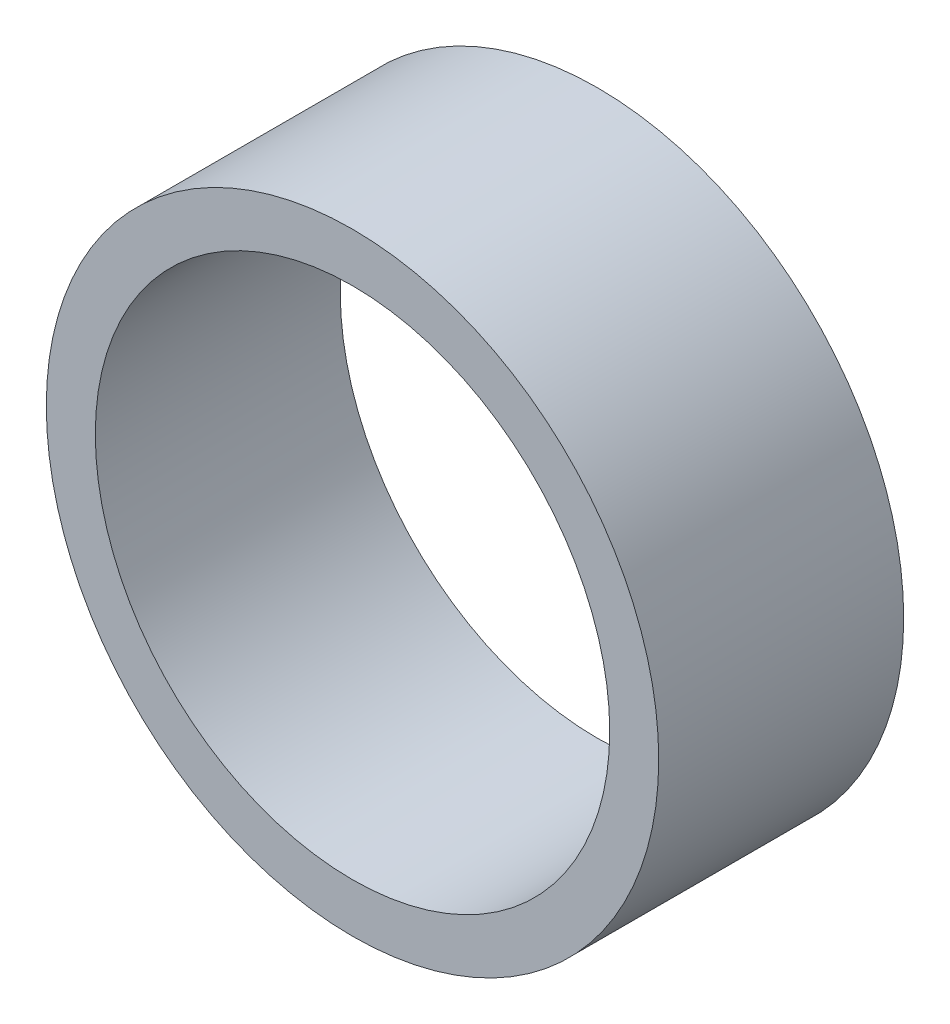
ISO-10303-21;
HEADER;
FILE_DESCRIPTION(('STEP AP214'),'2;1');
FILE_NAME('part.step','',(''),(''),'','','');
FILE_SCHEMA(('AUTOMOTIVE_DESIGN { 1 0 10303 214 1 1 1 1 }'));
ENDSEC;
DATA;
#1=APPLICATION_CONTEXT('core data for automotive mechanical design processes');
#2=APPLICATION_PROTOCOL_DEFINITION('international standard','automotive_design',2000,#1);
#3=PRODUCT_CONTEXT('',#1,'mechanical');
#4=PRODUCT('Part','Part','',(#3));
#5=PRODUCT_RELATED_PRODUCT_CATEGORY('part','',(#4));
#6=PRODUCT_DEFINITION_FORMATION('','',#4);
#7=PRODUCT_DEFINITION_CONTEXT('part definition',#1,'design');
#8=PRODUCT_DEFINITION('design','',#6,#7);
#9=PRODUCT_DEFINITION_SHAPE('','',#8);
#10=(LENGTH_UNIT() NAMED_UNIT(*) SI_UNIT(.MILLI.,.METRE.));
#11=(NAMED_UNIT(*) PLANE_ANGLE_UNIT() SI_UNIT($,.RADIAN.));
#12=(NAMED_UNIT(*) SI_UNIT($,.STERADIAN.) SOLID_ANGLE_UNIT());
#13=UNCERTAINTY_MEASURE_WITH_UNIT(LENGTH_MEASURE(1.E-05),#10,'distance_accuracy_value','');
#14=(GEOMETRIC_REPRESENTATION_CONTEXT(3) GLOBAL_UNCERTAINTY_ASSIGNED_CONTEXT((#13)) GLOBAL_UNIT_ASSIGNED_CONTEXT((#10,
#11,#12)) REPRESENTATION_CONTEXT('',''));
#15=CARTESIAN_POINT('',(0.,0.,0.));
#16=DIRECTION('',(0.,0.,1.));
#17=DIRECTION('',(1.,0.,0.));
#18=AXIS2_PLACEMENT_3D('',#15,#16,#17);
#19=CARTESIAN_POINT('',(0.,8.25,-4.));
#20=DIRECTION('',(0.,0.,1.));
#21=DIRECTION('',(1.,0.,0.));
#22=AXIS2_PLACEMENT_3D('',#19,#20,#21);
#23=CYLINDRICAL_SURFACE('',#22,5.);
#24=CARTESIAN_POINT('',(0.,8.25,-4.));
#25=DIRECTION('',(0.,0.,1.));
#26=DIRECTION('',(1.,0.,0.));
#27=AXIS2_PLACEMENT_3D('',#24,#25,#26);
#28=CIRCLE('',#27,5.);
#29=CARTESIAN_POINT('',(5.,8.25,-4.));
#30=VERTEX_POINT('',#29);
#31=EDGE_CURVE('E10',#30,#30,#28,.T.);
#32=ORIENTED_EDGE('',*,*,#31,.T.);
#33=EDGE_LOOP('',(#32));
#34=FACE_BOUND('',#33,.T.);
#35=CARTESIAN_POINT('',(0.,8.25,0.));
#36=DIRECTION('',(0.,0.,1.));
#37=DIRECTION('',(1.,0.,0.));
#38=AXIS2_PLACEMENT_3D('',#35,#36,#37);
#39=CIRCLE('',#38,5.);
#40=CARTESIAN_POINT('',(5.,8.25,0.));
#41=VERTEX_POINT('',#40);
#42=EDGE_CURVE('E37',#41,#41,#39,.T.);
#43=ORIENTED_EDGE('',*,*,#42,.F.);
#44=EDGE_LOOP('',(#43));
#45=FACE_BOUND('',#44,.T.);
#46=ADVANCED_FACE('F34',(#34,#45),#23,.T.);
#47=CARTESIAN_POINT('',(0.,8.25,-4.));
#48=DIRECTION('',(0.,0.,1.));
#49=DIRECTION('',(1.,0.,0.));
#50=AXIS2_PLACEMENT_3D('',#47,#48,#49);
#51=PLANE('',#50);
#52=CARTESIAN_POINT('',(0.,8.25000000000012,-4.));
#53=DIRECTION('',(0.,0.,1.));
#54=DIRECTION('',(1.,0.,0.));
#55=AXIS2_PLACEMENT_3D('',#52,#53,#54);
#56=CIRCLE('',#55,4.2);
#57=CARTESIAN_POINT('',(4.2,8.25000000000012,-4.));
#58=VERTEX_POINT('',#57);
#59=EDGE_CURVE('E44',#58,#58,#56,.T.);
#60=ORIENTED_EDGE('',*,*,#59,.T.);
#61=EDGE_LOOP('',(#60));
#62=FACE_BOUND('',#61,.T.);
#63=ORIENTED_EDGE('',*,*,#31,.F.);
#64=EDGE_LOOP('',(#63));
#65=FACE_BOUND('',#64,.T.);
#66=ADVANCED_FACE('F52',(#62,#65),#51,.F.);
#67=CARTESIAN_POINT('',(0.,8.25,0.));
#68=DIRECTION('',(0.,0.,1.));
#69=DIRECTION('',(1.,0.,0.));
#70=AXIS2_PLACEMENT_3D('',#67,#68,#69);
#71=PLANE('',#70);
#72=CARTESIAN_POINT('',(0.,8.25000000000012,0.));
#73=DIRECTION('',(0.,0.,1.));
#74=DIRECTION('',(1.,0.,0.));
#75=AXIS2_PLACEMENT_3D('',#72,#73,#74);
#76=CIRCLE('',#75,4.2);
#77=CARTESIAN_POINT('',(4.2,8.25000000000012,0.));
#78=VERTEX_POINT('',#77);
#79=EDGE_CURVE('E46',#78,#78,#76,.T.);
#80=ORIENTED_EDGE('',*,*,#79,.F.);
#81=EDGE_LOOP('',(#80));
#82=FACE_BOUND('',#81,.T.);
#83=ORIENTED_EDGE('',*,*,#42,.T.);
#84=EDGE_LOOP('',(#83));
#85=FACE_BOUND('',#84,.T.);
#86=ADVANCED_FACE('F58',(#82,#85),#71,.T.);
#87=CARTESIAN_POINT('',(0.,8.25000000000012,-4.));
#88=DIRECTION('',(0.,0.,1.));
#89=DIRECTION('',(1.,0.,0.));
#90=AXIS2_PLACEMENT_3D('',#87,#88,#89);
#91=CYLINDRICAL_SURFACE('',#90,4.2);
#92=ORIENTED_EDGE('',*,*,#59,.F.);
#93=EDGE_LOOP('',(#92));
#94=FACE_BOUND('',#93,.T.);
#95=ORIENTED_EDGE('',*,*,#79,.T.);
#96=EDGE_LOOP('',(#95));
#97=FACE_BOUND('',#96,.T.);
#98=ADVANCED_FACE('F55',(#94,#97),#91,.F.);
#99=CLOSED_SHELL('',(#46,#66,#86,#98));
#100=MANIFOLD_SOLID_BREP('B2',#99);
#101=ADVANCED_BREP_SHAPE_REPRESENTATION('',(#18,#100),#14);
#102=SHAPE_DEFINITION_REPRESENTATION(#9,#101);
ENDSEC;
END-ISO-10303-21;
